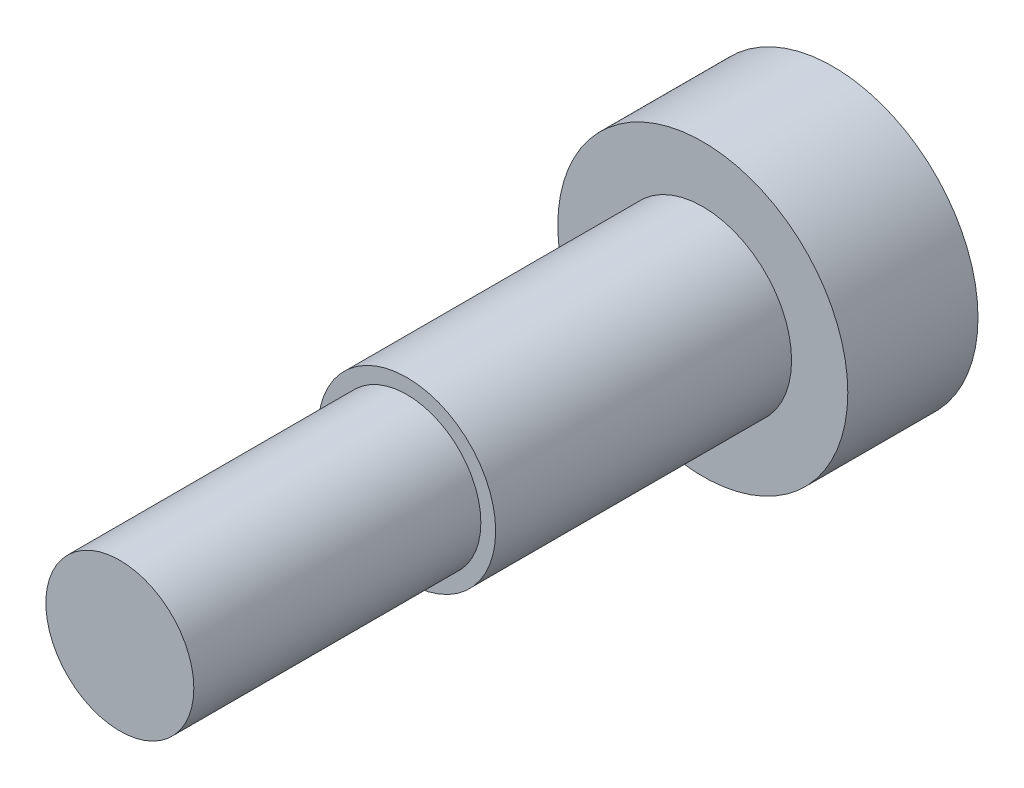
ISO-10303-21;
HEADER;
FILE_DESCRIPTION(('STEP AP214'),'2;1');
FILE_NAME('part.step','',(''),(''),'','','');
FILE_SCHEMA(('AUTOMOTIVE_DESIGN { 1 0 10303 214 1 1 1 1 }'));
ENDSEC;
DATA;
#1=APPLICATION_CONTEXT('core data for automotive mechanical design processes');
#2=APPLICATION_PROTOCOL_DEFINITION('international standard','automotive_design',2000,#1);
#3=PRODUCT_CONTEXT('',#1,'mechanical');
#4=PRODUCT('Part','Part','',(#3));
#5=PRODUCT_RELATED_PRODUCT_CATEGORY('part','',(#4));
#6=PRODUCT_DEFINITION_FORMATION('','',#4);
#7=PRODUCT_DEFINITION_CONTEXT('part definition',#1,'design');
#8=PRODUCT_DEFINITION('design','',#6,#7);
#9=PRODUCT_DEFINITION_SHAPE('','',#8);
#10=(LENGTH_UNIT() NAMED_UNIT(*) SI_UNIT(.MILLI.,.METRE.));
#11=(NAMED_UNIT(*) PLANE_ANGLE_UNIT() SI_UNIT($,.RADIAN.));
#12=(NAMED_UNIT(*) SI_UNIT($,.STERADIAN.) SOLID_ANGLE_UNIT());
#13=UNCERTAINTY_MEASURE_WITH_UNIT(LENGTH_MEASURE(1.E-05),#10,'distance_accuracy_value','');
#14=(GEOMETRIC_REPRESENTATION_CONTEXT(3) GLOBAL_UNCERTAINTY_ASSIGNED_CONTEXT((#13)) GLOBAL_UNIT_ASSIGNED_CONTEXT((#10,
#11,#12)) REPRESENTATION_CONTEXT('',''));
#15=CARTESIAN_POINT('',(0.,0.,0.));
#16=DIRECTION('',(0.,0.,1.));
#17=DIRECTION('',(1.,0.,0.));
#18=AXIS2_PLACEMENT_3D('',#15,#16,#17);
#19=CARTESIAN_POINT('',(0.,0.,4.4));
#20=DIRECTION('',(0.,0.,-1.));
#21=DIRECTION('',(-1.,0.,0.));
#22=AXIS2_PLACEMENT_3D('',#19,#20,#21);
#23=CYLINDRICAL_SURFACE('',#22,4.9);
#24=CARTESIAN_POINT('',(0.,0.,4.4));
#25=DIRECTION('',(0.,0.,1.));
#26=DIRECTION('',(1.,0.,0.));
#27=AXIS2_PLACEMENT_3D('',#24,#25,#26);
#28=CIRCLE('',#27,4.9);
#29=CARTESIAN_POINT('',(4.9,0.,4.4));
#30=VERTEX_POINT('',#29);
#31=EDGE_CURVE('E152',#30,#30,#28,.T.);
#32=ORIENTED_EDGE('',*,*,#31,.F.);
#33=EDGE_LOOP('',(#32));
#34=FACE_BOUND('',#33,.T.);
#35=CARTESIAN_POINT('',(0.,0.,0.));
#36=DIRECTION('',(0.,0.,1.));
#37=DIRECTION('',(1.,0.,0.));
#38=AXIS2_PLACEMENT_3D('',#35,#36,#37);
#39=CIRCLE('',#38,4.9);
#40=CARTESIAN_POINT('',(4.9,0.,0.));
#41=VERTEX_POINT('',#40);
#42=EDGE_CURVE('E40',#41,#41,#39,.T.);
#43=ORIENTED_EDGE('',*,*,#42,.T.);
#44=EDGE_LOOP('',(#43));
#45=FACE_BOUND('',#44,.T.);
#46=ADVANCED_FACE('F37',(#34,#45),#23,.T.);
#47=CARTESIAN_POINT('',(0.,0.,4.4));
#48=DIRECTION('',(0.,0.,1.));
#49=DIRECTION('',(1.,0.,0.));
#50=AXIS2_PLACEMENT_3D('',#47,#48,#49);
#51=PLANE('',#50);
#52=CARTESIAN_POINT('',(0.,0.,4.4));
#53=DIRECTION('',(0.,0.,1.));
#54=DIRECTION('',(1.,0.,0.));
#55=AXIS2_PLACEMENT_3D('',#52,#53,#54);
#56=CIRCLE('',#55,3.);
#57=CARTESIAN_POINT('',(3.,0.,4.4));
#58=VERTEX_POINT('',#57);
#59=EDGE_CURVE('E45',#58,#58,#56,.T.);
#60=ORIENTED_EDGE('',*,*,#59,.F.);
#61=EDGE_LOOP('',(#60));
#62=FACE_BOUND('',#61,.T.);
#63=ORIENTED_EDGE('',*,*,#31,.T.);
#64=EDGE_LOOP('',(#63));
#65=FACE_BOUND('',#64,.T.);
#66=ADVANCED_FACE('F163',(#62,#65),#51,.T.);
#67=CARTESIAN_POINT('',(0.,0.,0.));
#68=DIRECTION('',(0.,0.,1.));
#69=DIRECTION('',(1.,0.,0.));
#70=AXIS2_PLACEMENT_3D('',#67,#68,#69);
#71=PLANE('',#70);
#72=DIRECTION('',(0.866025403784439,-0.5,0.));
#73=VECTOR('',#72,1.);
#74=CARTESIAN_POINT('',(0.,1.73205080756888,0.));
#75=LINE('',#74,#73);
#76=CARTESIAN_POINT('',(0.,1.73205080756888,0.));
#77=VERTEX_POINT('',#76);
#78=CARTESIAN_POINT('',(1.5,0.866025403784438,0.));
#79=VERTEX_POINT('',#78);
#80=EDGE_CURVE('E127',#77,#79,#75,.T.);
#81=ORIENTED_EDGE('',*,*,#80,.F.);
#82=DIRECTION('',(0.866025403784439,0.5,0.));
#83=VECTOR('',#82,1.);
#84=CARTESIAN_POINT('',(-1.5,0.866025403784439,0.));
#85=LINE('',#84,#83);
#86=CARTESIAN_POINT('',(-1.5,0.866025403784439,0.));
#87=VERTEX_POINT('',#86);
#88=EDGE_CURVE('E53',#87,#77,#85,.T.);
#89=ORIENTED_EDGE('',*,*,#88,.F.);
#90=DIRECTION('',(0.,1.,0.));
#91=VECTOR('',#90,1.);
#92=CARTESIAN_POINT('',(-1.5,-0.866025403784441,0.));
#93=LINE('',#92,#91);
#94=CARTESIAN_POINT('',(-1.5,-0.866025403784441,0.));
#95=VERTEX_POINT('',#94);
#96=EDGE_CURVE('E136',#95,#87,#93,.T.);
#97=ORIENTED_EDGE('',*,*,#96,.F.);
#98=DIRECTION('',(-0.866025403784439,0.5,0.));
#99=VECTOR('',#98,1.);
#100=CARTESIAN_POINT('',(0.,-1.73205080756888,0.));
#101=LINE('',#100,#99);
#102=CARTESIAN_POINT('',(0.,-1.73205080756888,0.));
#103=VERTEX_POINT('',#102);
#104=EDGE_CURVE('E134',#103,#95,#101,.T.);
#105=ORIENTED_EDGE('',*,*,#104,.F.);
#106=DIRECTION('',(-0.866025403784438,-0.5,0.));
#107=VECTOR('',#106,1.);
#108=CARTESIAN_POINT('',(1.5,-0.86602540378444,0.));
#109=LINE('',#108,#107);
#110=CARTESIAN_POINT('',(1.5,-0.86602540378444,0.));
#111=VERTEX_POINT('',#110);
#112=EDGE_CURVE('E101',#111,#103,#109,.T.);
#113=ORIENTED_EDGE('',*,*,#112,.F.);
#114=DIRECTION('',(0.,-1.,0.));
#115=VECTOR('',#114,1.);
#116=CARTESIAN_POINT('',(1.5,0.866025403784438,0.));
#117=LINE('',#116,#115);
#118=EDGE_CURVE('E130',#79,#111,#117,.T.);
#119=ORIENTED_EDGE('',*,*,#118,.F.);
#120=EDGE_LOOP('',(#81,#89,#97,#105,#113,#119));
#121=FACE_BOUND('',#120,.T.);
#122=ORIENTED_EDGE('',*,*,#42,.F.);
#123=EDGE_LOOP('',(#122));
#124=FACE_BOUND('',#123,.T.);
#125=ADVANCED_FACE('F160',(#121,#124),#71,.F.);
#126=CARTESIAN_POINT('',(0.,0.,14.4));
#127=DIRECTION('',(0.,0.,-1.));
#128=DIRECTION('',(-1.,0.,0.));
#129=AXIS2_PLACEMENT_3D('',#126,#127,#128);
#130=CYLINDRICAL_SURFACE('',#129,3.);
#131=CARTESIAN_POINT('',(0.,0.,14.4));
#132=DIRECTION('',(0.,0.,1.));
#133=DIRECTION('',(1.,0.,0.));
#134=AXIS2_PLACEMENT_3D('',#131,#132,#133);
#135=CIRCLE('',#134,3.);
#136=CARTESIAN_POINT('',(3.,0.,14.4));
#137=VERTEX_POINT('',#136);
#138=EDGE_CURVE('E147',#137,#137,#135,.T.);
#139=ORIENTED_EDGE('',*,*,#138,.F.);
#140=EDGE_LOOP('',(#139));
#141=FACE_BOUND('',#140,.T.);
#142=ORIENTED_EDGE('',*,*,#59,.T.);
#143=EDGE_LOOP('',(#142));
#144=FACE_BOUND('',#143,.T.);
#145=ADVANCED_FACE('F162',(#141,#144),#130,.T.);
#146=CARTESIAN_POINT('',(0.,0.,14.4));
#147=DIRECTION('',(0.,0.,1.));
#148=DIRECTION('',(1.,0.,0.));
#149=AXIS2_PLACEMENT_3D('',#146,#147,#148);
#150=PLANE('',#149);
#151=CARTESIAN_POINT('',(0.,0.,14.4));
#152=DIRECTION('',(0.,0.,1.));
#153=DIRECTION('',(1.,0.,0.));
#154=AXIS2_PLACEMENT_3D('',#151,#152,#153);
#155=CIRCLE('',#154,2.5);
#156=CARTESIAN_POINT('',(2.5,0.,14.4));
#157=VERTEX_POINT('',#156);
#158=EDGE_CURVE('E11',#157,#157,#155,.T.);
#159=ORIENTED_EDGE('',*,*,#158,.F.);
#160=EDGE_LOOP('',(#159));
#161=FACE_BOUND('',#160,.T.);
#162=ORIENTED_EDGE('',*,*,#138,.T.);
#163=EDGE_LOOP('',(#162));
#164=FACE_BOUND('',#163,.T.);
#165=ADVANCED_FACE('F170',(#161,#164),#150,.T.);
#166=CARTESIAN_POINT('',(0.,0.,24.1));
#167=DIRECTION('',(0.,0.,-1.));
#168=DIRECTION('',(-1.,0.,0.));
#169=AXIS2_PLACEMENT_3D('',#166,#167,#168);
#170=CYLINDRICAL_SURFACE('',#169,2.5);
#171=CARTESIAN_POINT('',(0.,0.,24.1));
#172=DIRECTION('',(0.,0.,1.));
#173=DIRECTION('',(1.,0.,0.));
#174=AXIS2_PLACEMENT_3D('',#171,#172,#173);
#175=CIRCLE('',#174,2.5);
#176=CARTESIAN_POINT('',(2.5,0.,24.1));
#177=VERTEX_POINT('',#176);
#178=EDGE_CURVE('E140',#177,#177,#175,.T.);
#179=ORIENTED_EDGE('',*,*,#178,.F.);
#180=EDGE_LOOP('',(#179));
#181=FACE_BOUND('',#180,.T.);
#182=ORIENTED_EDGE('',*,*,#158,.T.);
#183=EDGE_LOOP('',(#182));
#184=FACE_BOUND('',#183,.T.);
#185=ADVANCED_FACE('F195',(#181,#184),#170,.T.);
#186=CARTESIAN_POINT('',(0.,0.,24.1));
#187=DIRECTION('',(0.,0.,1.));
#188=DIRECTION('',(1.,0.,0.));
#189=AXIS2_PLACEMENT_3D('',#186,#187,#188);
#190=PLANE('',#189);
#191=ORIENTED_EDGE('',*,*,#178,.T.);
#192=EDGE_LOOP('',(#191));
#193=FACE_BOUND('',#192,.T.);
#194=ADVANCED_FACE('F202',(#193),#190,.T.);
#195=CARTESIAN_POINT('',(-1.5,0.866025403784439,2.));
#196=DIRECTION('',(-0.5,0.866025403784439,0.));
#197=DIRECTION('',(-0.866025403784439,-0.5,0.));
#198=AXIS2_PLACEMENT_3D('',#195,#196,#197);
#199=PLANE('',#198);
#200=ORIENTED_EDGE('',*,*,#88,.T.);
#201=DIRECTION('',(0.,0.,-1.));
#202=VECTOR('',#201,1.);
#203=CARTESIAN_POINT('',(0.,1.73205080756888,2.));
#204=LINE('',#203,#202);
#205=CARTESIAN_POINT('',(0.,1.73205080756888,2.));
#206=VERTEX_POINT('',#205);
#207=EDGE_CURVE('E83',#206,#77,#204,.T.);
#208=ORIENTED_EDGE('',*,*,#207,.F.);
#209=DIRECTION('',(0.866025403784439,0.5,0.));
#210=VECTOR('',#209,1.);
#211=CARTESIAN_POINT('',(-1.5,0.866025403784439,2.));
#212=LINE('',#211,#210);
#213=CARTESIAN_POINT('',(-1.5,0.866025403784439,2.));
#214=VERTEX_POINT('',#213);
#215=EDGE_CURVE('E138',#214,#206,#212,.T.);
#216=ORIENTED_EDGE('',*,*,#215,.F.);
#217=DIRECTION('',(0.,0.,-1.));
#218=VECTOR('',#217,1.);
#219=CARTESIAN_POINT('',(-1.5,0.866025403784439,2.));
#220=LINE('',#219,#218);
#221=EDGE_CURVE('E61',#214,#87,#220,.T.);
#222=ORIENTED_EDGE('',*,*,#221,.T.);
#223=EDGE_LOOP('',(#200,#208,#216,#222));
#224=FACE_BOUND('',#223,.T.);
#225=ADVANCED_FACE('F209',(#224),#199,.F.);
#226=CARTESIAN_POINT('',(-1.5,-0.866025403784441,2.));
#227=DIRECTION('',(-1.,0.,0.));
#228=DIRECTION('',(0.,0.,1.));
#229=AXIS2_PLACEMENT_3D('',#226,#227,#228);
#230=PLANE('',#229);
#231=ORIENTED_EDGE('',*,*,#96,.T.);
#232=ORIENTED_EDGE('',*,*,#221,.F.);
#233=DIRECTION('',(0.,1.,0.));
#234=VECTOR('',#233,1.);
#235=CARTESIAN_POINT('',(-1.5,-0.866025403784441,2.));
#236=LINE('',#235,#234);
#237=CARTESIAN_POINT('',(-1.5,-0.866025403784441,2.));
#238=VERTEX_POINT('',#237);
#239=EDGE_CURVE('E113',#238,#214,#236,.T.);
#240=ORIENTED_EDGE('',*,*,#239,.F.);
#241=DIRECTION('',(0.,0.,-1.));
#242=VECTOR('',#241,1.);
#243=CARTESIAN_POINT('',(-1.5,-0.866025403784441,2.));
#244=LINE('',#243,#242);
#245=EDGE_CURVE('E105',#238,#95,#244,.T.);
#246=ORIENTED_EDGE('',*,*,#245,.T.);
#247=EDGE_LOOP('',(#231,#232,#240,#246));
#248=FACE_BOUND('',#247,.T.);
#249=ADVANCED_FACE('F218',(#248),#230,.F.);
#250=CARTESIAN_POINT('',(0.,-1.73205080756888,2.));
#251=DIRECTION('',(-0.5,-0.866025403784439,0.));
#252=DIRECTION('',(0.866025403784439,-0.5,0.));
#253=AXIS2_PLACEMENT_3D('',#250,#251,#252);
#254=PLANE('',#253);
#255=ORIENTED_EDGE('',*,*,#104,.T.);
#256=ORIENTED_EDGE('',*,*,#245,.F.);
#257=DIRECTION('',(-0.866025403784439,0.5,0.));
#258=VECTOR('',#257,1.);
#259=CARTESIAN_POINT('',(0.,-1.73205080756888,2.));
#260=LINE('',#259,#258);
#261=CARTESIAN_POINT('',(0.,-1.73205080756888,2.));
#262=VERTEX_POINT('',#261);
#263=EDGE_CURVE('E109',#262,#238,#260,.T.);
#264=ORIENTED_EDGE('',*,*,#263,.F.);
#265=DIRECTION('',(0.,0.,-1.));
#266=VECTOR('',#265,1.);
#267=CARTESIAN_POINT('',(0.,-1.73205080756888,2.));
#268=LINE('',#267,#266);
#269=EDGE_CURVE('E94',#262,#103,#268,.T.);
#270=ORIENTED_EDGE('',*,*,#269,.T.);
#271=EDGE_LOOP('',(#255,#256,#264,#270));
#272=FACE_BOUND('',#271,.T.);
#273=ADVANCED_FACE('F110',(#272),#254,.F.);
#274=CARTESIAN_POINT('',(1.5,-0.86602540378444,2.));
#275=DIRECTION('',(0.5,-0.866025403784438,0.));
#276=DIRECTION('',(0.866025403784439,0.5,0.));
#277=AXIS2_PLACEMENT_3D('',#274,#275,#276);
#278=PLANE('',#277);
#279=ORIENTED_EDGE('',*,*,#112,.T.);
#280=ORIENTED_EDGE('',*,*,#269,.F.);
#281=DIRECTION('',(-0.866025403784438,-0.5,0.));
#282=VECTOR('',#281,1.);
#283=CARTESIAN_POINT('',(1.5,-0.86602540378444,2.));
#284=LINE('',#283,#282);
#285=CARTESIAN_POINT('',(1.5,-0.86602540378444,2.));
#286=VERTEX_POINT('',#285);
#287=EDGE_CURVE('E98',#286,#262,#284,.T.);
#288=ORIENTED_EDGE('',*,*,#287,.F.);
#289=DIRECTION('',(0.,0.,-1.));
#290=VECTOR('',#289,1.);
#291=CARTESIAN_POINT('',(1.5,-0.86602540378444,2.));
#292=LINE('',#291,#290);
#293=EDGE_CURVE('E106',#286,#111,#292,.T.);
#294=ORIENTED_EDGE('',*,*,#293,.T.);
#295=EDGE_LOOP('',(#279,#280,#288,#294));
#296=FACE_BOUND('',#295,.T.);
#297=ADVANCED_FACE('F96',(#296),#278,.F.);
#298=CARTESIAN_POINT('',(1.5,0.866025403784438,2.));
#299=DIRECTION('',(1.,0.,0.));
#300=DIRECTION('',(0.,1.,0.));
#301=AXIS2_PLACEMENT_3D('',#298,#299,#300);
#302=PLANE('',#301);
#303=ORIENTED_EDGE('',*,*,#118,.T.);
#304=ORIENTED_EDGE('',*,*,#293,.F.);
#305=DIRECTION('',(0.,-1.,0.));
#306=VECTOR('',#305,1.);
#307=CARTESIAN_POINT('',(1.5,0.866025403784438,2.));
#308=LINE('',#307,#306);
#309=CARTESIAN_POINT('',(1.5,0.866025403784438,2.));
#310=VERTEX_POINT('',#309);
#311=EDGE_CURVE('E119',#310,#286,#308,.T.);
#312=ORIENTED_EDGE('',*,*,#311,.F.);
#313=DIRECTION('',(0.,0.,-1.));
#314=VECTOR('',#313,1.);
#315=CARTESIAN_POINT('',(1.5,0.866025403784438,2.));
#316=LINE('',#315,#314);
#317=EDGE_CURVE('E143',#310,#79,#316,.T.);
#318=ORIENTED_EDGE('',*,*,#317,.T.);
#319=EDGE_LOOP('',(#303,#304,#312,#318));
#320=FACE_BOUND('',#319,.T.);
#321=ADVANCED_FACE('F237',(#320),#302,.F.);
#322=CARTESIAN_POINT('',(0.,1.73205080756888,2.));
#323=DIRECTION('',(0.5,0.866025403784439,0.));
#324=DIRECTION('',(-0.866025403784439,0.5,0.));
#325=AXIS2_PLACEMENT_3D('',#322,#323,#324);
#326=PLANE('',#325);
#327=ORIENTED_EDGE('',*,*,#80,.T.);
#328=ORIENTED_EDGE('',*,*,#317,.F.);
#329=DIRECTION('',(0.866025403784439,-0.5,0.));
#330=VECTOR('',#329,1.);
#331=CARTESIAN_POINT('',(0.,1.73205080756888,2.));
#332=LINE('',#331,#330);
#333=EDGE_CURVE('E121',#206,#310,#332,.T.);
#334=ORIENTED_EDGE('',*,*,#333,.F.);
#335=ORIENTED_EDGE('',*,*,#207,.T.);
#336=EDGE_LOOP('',(#327,#328,#334,#335));
#337=FACE_BOUND('',#336,.T.);
#338=ADVANCED_FACE('F244',(#337),#326,.F.);
#339=CARTESIAN_POINT('',(0.,0.,2.));
#340=DIRECTION('',(0.,0.,-1.));
#341=DIRECTION('',(-1.,0.,0.));
#342=AXIS2_PLACEMENT_3D('',#339,#340,#341);
#343=PLANE('',#342);
#344=ORIENTED_EDGE('',*,*,#215,.T.);
#345=ORIENTED_EDGE('',*,*,#333,.T.);
#346=ORIENTED_EDGE('',*,*,#311,.T.);
#347=ORIENTED_EDGE('',*,*,#287,.T.);
#348=ORIENTED_EDGE('',*,*,#263,.T.);
#349=ORIENTED_EDGE('',*,*,#239,.T.);
#350=EDGE_LOOP('',(#344,#345,#346,#347,#348,#349));
#351=FACE_BOUND('',#350,.T.);
#352=ADVANCED_FACE('F116',(#351),#343,.T.);
#353=CLOSED_SHELL('',(#46,#66,#125,#145,#165,#185,#194,#225,#249,#273,#297,#321,#338,#352));
#354=MANIFOLD_SOLID_BREP('B2',#353);
#355=ADVANCED_BREP_SHAPE_REPRESENTATION('',(#18,#354),#14);
#356=SHAPE_DEFINITION_REPRESENTATION(#9,#355);
ENDSEC;
END-ISO-10303-21;
